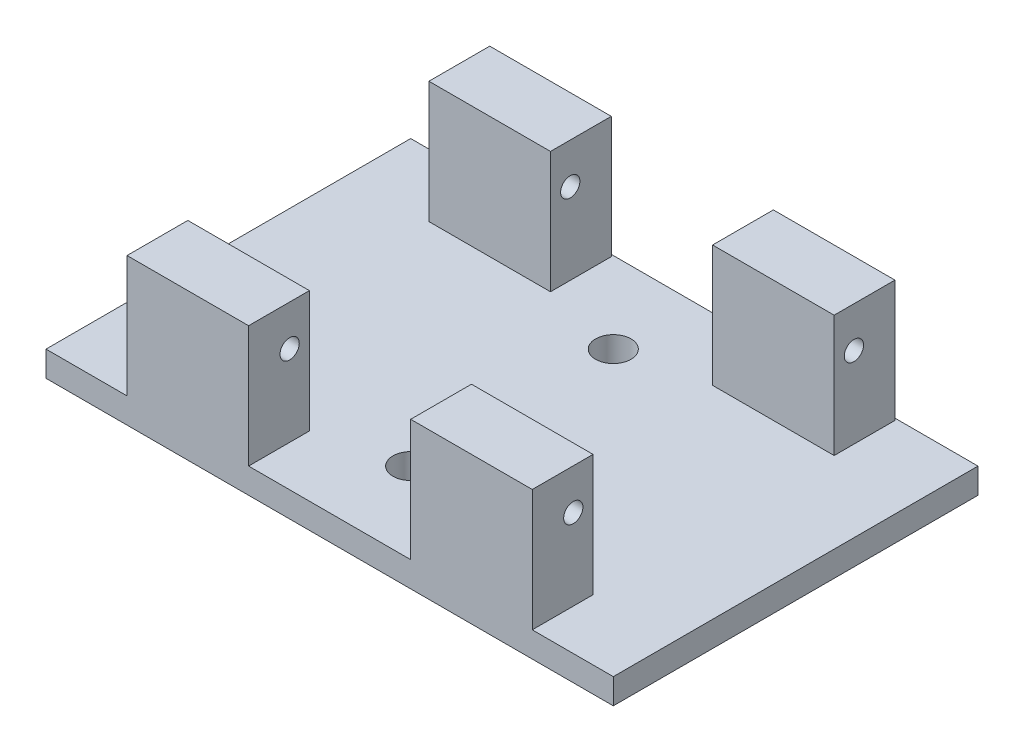
ISO-10303-21;
HEADER;
FILE_DESCRIPTION(('STEP AP214'),'2;1');
FILE_NAME('part.step','',(''),(''),'','','');
FILE_SCHEMA(('AUTOMOTIVE_DESIGN { 1 0 10303 214 1 1 1 1 }'));
ENDSEC;
DATA;
#1=APPLICATION_CONTEXT('core data for automotive mechanical design processes');
#2=APPLICATION_PROTOCOL_DEFINITION('international standard','automotive_design',2000,#1);
#3=PRODUCT_CONTEXT('',#1,'mechanical');
#4=PRODUCT('Part','Part','',(#3));
#5=PRODUCT_RELATED_PRODUCT_CATEGORY('part','',(#4));
#6=PRODUCT_DEFINITION_FORMATION('','',#4);
#7=PRODUCT_DEFINITION_CONTEXT('part definition',#1,'design');
#8=PRODUCT_DEFINITION('design','',#6,#7);
#9=PRODUCT_DEFINITION_SHAPE('','',#8);
#10=(LENGTH_UNIT() NAMED_UNIT(*) SI_UNIT(.MILLI.,.METRE.));
#11=(NAMED_UNIT(*) PLANE_ANGLE_UNIT() SI_UNIT($,.RADIAN.));
#12=(NAMED_UNIT(*) SI_UNIT($,.STERADIAN.) SOLID_ANGLE_UNIT());
#13=UNCERTAINTY_MEASURE_WITH_UNIT(LENGTH_MEASURE(1.E-05),#10,'distance_accuracy_value','');
#14=(GEOMETRIC_REPRESENTATION_CONTEXT(3) GLOBAL_UNCERTAINTY_ASSIGNED_CONTEXT((#13)) GLOBAL_UNIT_ASSIGNED_CONTEXT((#10,
#11,#12)) REPRESENTATION_CONTEXT('',''));
#15=CARTESIAN_POINT('',(0.,0.,0.));
#16=DIRECTION('',(0.,0.,1.));
#17=DIRECTION('',(1.,0.,0.));
#18=AXIS2_PLACEMENT_3D('',#15,#16,#17);
#19=CARTESIAN_POINT('',(0.,2.5,0.));
#20=DIRECTION('',(0.,1.,0.));
#21=DIRECTION('',(0.,0.,1.));
#22=AXIS2_PLACEMENT_3D('',#19,#20,#21);
#23=PLANE('',#22);
#24=CARTESIAN_POINT('',(0.,2.5,10.));
#25=DIRECTION('',(0.,1.,0.));
#26=DIRECTION('',(0.,0.,1.));
#27=AXIS2_PLACEMENT_3D('',#24,#25,#26);
#28=CIRCLE('',#27,1.75);
#29=CARTESIAN_POINT('',(0.,2.5,11.75));
#30=VERTEX_POINT('',#29);
#31=EDGE_CURVE('E691',#30,#30,#28,.T.);
#32=ORIENTED_EDGE('',*,*,#31,.F.);
#33=EDGE_LOOP('',(#32));
#34=FACE_BOUND('',#33,.T.);
#35=CARTESIAN_POINT('',(0.,2.5,-10.));
#36=DIRECTION('',(0.,1.,0.));
#37=DIRECTION('',(0.,0.,1.));
#38=AXIS2_PLACEMENT_3D('',#35,#36,#37);
#39=CIRCLE('',#38,1.75);
#40=CARTESIAN_POINT('',(0.,2.5,-8.25));
#41=VERTEX_POINT('',#40);
#42=EDGE_CURVE('E692',#41,#41,#39,.T.);
#43=ORIENTED_EDGE('',*,*,#42,.F.);
#44=EDGE_LOOP('',(#43));
#45=FACE_BOUND('',#44,.T.);
#46=DIRECTION('',(0.,0.,1.));
#47=VECTOR('',#46,1.);
#48=CARTESIAN_POINT('',(-8.,2.5,-17.8));
#49=LINE('',#48,#47);
#50=CARTESIAN_POINT('',(-8.,2.5,-17.8));
#51=VERTEX_POINT('',#50);
#52=CARTESIAN_POINT('',(-8.,2.5,-11.8));
#53=VERTEX_POINT('',#52);
#54=EDGE_CURVE('E183',#51,#53,#49,.T.);
#55=ORIENTED_EDGE('',*,*,#54,.T.);
#56=DIRECTION('',(-1.,0.,0.));
#57=VECTOR('',#56,1.);
#58=CARTESIAN_POINT('',(-8.,2.5,-11.8));
#59=LINE('',#58,#57);
#60=CARTESIAN_POINT('',(-20.,2.5,-11.8));
#61=VERTEX_POINT('',#60);
#62=EDGE_CURVE('E197',#53,#61,#59,.T.);
#63=ORIENTED_EDGE('',*,*,#62,.T.);
#64=DIRECTION('',(0.,0.,-1.));
#65=VECTOR('',#64,1.);
#66=CARTESIAN_POINT('',(-20.,2.5,-17.8));
#67=LINE('',#66,#65);
#68=CARTESIAN_POINT('',(-20.,2.5,-17.8));
#69=VERTEX_POINT('',#68);
#70=EDGE_CURVE('E61',#61,#69,#67,.T.);
#71=ORIENTED_EDGE('',*,*,#70,.T.);
#72=DIRECTION('',(1.,0.,0.));
#73=VECTOR('',#72,1.);
#74=CARTESIAN_POINT('',(-8.,2.5,-17.8));
#75=LINE('',#74,#73);
#76=EDGE_CURVE('E56',#69,#51,#75,.T.);
#77=ORIENTED_EDGE('',*,*,#76,.T.);
#78=EDGE_LOOP('',(#55,#63,#71,#77));
#79=FACE_BOUND('',#78,.T.);
#80=DIRECTION('',(0.,0.,1.));
#81=VECTOR('',#80,1.);
#82=CARTESIAN_POINT('',(-8.,2.5,12.));
#83=LINE('',#82,#81);
#84=CARTESIAN_POINT('',(-8.,2.5,12.));
#85=VERTEX_POINT('',#84);
#86=CARTESIAN_POINT('',(-8.,2.5,18.));
#87=VERTEX_POINT('',#86);
#88=EDGE_CURVE('E231',#85,#87,#83,.T.);
#89=ORIENTED_EDGE('',*,*,#88,.T.);
#90=DIRECTION('',(1.,0.,0.));
#91=VECTOR('',#90,1.);
#92=CARTESIAN_POINT('',(-28.,2.5,18.));
#93=LINE('',#92,#91);
#94=CARTESIAN_POINT('',(7.99999999999999,2.5,18.));
#95=VERTEX_POINT('',#94);
#96=EDGE_CURVE('E331',#87,#95,#93,.T.);
#97=ORIENTED_EDGE('',*,*,#96,.T.);
#98=DIRECTION('',(0.,0.,1.));
#99=VECTOR('',#98,1.);
#100=CARTESIAN_POINT('',(8.,2.5,12.));
#101=LINE('',#100,#99);
#102=CARTESIAN_POINT('',(8.,2.5,12.));
#103=VERTEX_POINT('',#102);
#104=EDGE_CURVE('E275',#103,#95,#101,.T.);
#105=ORIENTED_EDGE('',*,*,#104,.F.);
#106=DIRECTION('',(-1.,0.,0.));
#107=VECTOR('',#106,1.);
#108=CARTESIAN_POINT('',(8.,2.5,12.));
#109=LINE('',#108,#107);
#110=CARTESIAN_POINT('',(20.,2.5,12.));
#111=VERTEX_POINT('',#110);
#112=EDGE_CURVE('E303',#111,#103,#109,.T.);
#113=ORIENTED_EDGE('',*,*,#112,.F.);
#114=DIRECTION('',(0.,0.,-1.));
#115=VECTOR('',#114,1.);
#116=CARTESIAN_POINT('',(20.,2.5,12.));
#117=LINE('',#116,#115);
#118=CARTESIAN_POINT('',(20.,2.5,18.));
#119=VERTEX_POINT('',#118);
#120=EDGE_CURVE('E306',#119,#111,#117,.T.);
#121=ORIENTED_EDGE('',*,*,#120,.F.);
#122=CARTESIAN_POINT('',(28.,2.5,18.));
#123=VERTEX_POINT('',#122);
#124=EDGE_CURVE('E327',#119,#123,#93,.T.);
#125=ORIENTED_EDGE('',*,*,#124,.T.);
#126=DIRECTION('',(0.,0.,-1.));
#127=VECTOR('',#126,1.);
#128=CARTESIAN_POINT('',(28.,2.5,-18.));
#129=LINE('',#128,#127);
#130=CARTESIAN_POINT('',(28.,2.5,-18.));
#131=VERTEX_POINT('',#130);
#132=EDGE_CURVE('E319',#123,#131,#129,.T.);
#133=ORIENTED_EDGE('',*,*,#132,.T.);
#134=DIRECTION('',(-1.,0.,0.));
#135=VECTOR('',#134,1.);
#136=CARTESIAN_POINT('',(-28.,2.5,-18.));
#137=LINE('',#136,#135);
#138=CARTESIAN_POINT('',(-28.,2.5,-18.));
#139=VERTEX_POINT('',#138);
#140=EDGE_CURVE('E322',#131,#139,#137,.T.);
#141=ORIENTED_EDGE('',*,*,#140,.T.);
#142=DIRECTION('',(0.,0.,1.));
#143=VECTOR('',#142,1.);
#144=CARTESIAN_POINT('',(-28.,2.5,-18.));
#145=LINE('',#144,#143);
#146=CARTESIAN_POINT('',(-28.,2.5,18.));
#147=VERTEX_POINT('',#146);
#148=EDGE_CURVE('E325',#139,#147,#145,.T.);
#149=ORIENTED_EDGE('',*,*,#148,.T.);
#150=CARTESIAN_POINT('',(-20.,2.5,18.));
#151=VERTEX_POINT('',#150);
#152=EDGE_CURVE('E328',#147,#151,#93,.T.);
#153=ORIENTED_EDGE('',*,*,#152,.T.);
#154=DIRECTION('',(0.,0.,-1.));
#155=VECTOR('',#154,1.);
#156=CARTESIAN_POINT('',(-20.,2.5,12.));
#157=LINE('',#156,#155);
#158=CARTESIAN_POINT('',(-20.,2.5,12.));
#159=VERTEX_POINT('',#158);
#160=EDGE_CURVE('E221',#151,#159,#157,.T.);
#161=ORIENTED_EDGE('',*,*,#160,.T.);
#162=DIRECTION('',(1.,0.,0.));
#163=VECTOR('',#162,1.);
#164=CARTESIAN_POINT('',(-8.,2.5,12.));
#165=LINE('',#164,#163);
#166=EDGE_CURVE('E234',#159,#85,#165,.T.);
#167=ORIENTED_EDGE('',*,*,#166,.T.);
#168=EDGE_LOOP('',(#89,#97,#105,#113,#121,#125,#133,#141,#149,#153,#161,#167));
#169=FACE_BOUND('',#168,.T.);
#170=DIRECTION('',(1.,0.,0.));
#171=VECTOR('',#170,1.);
#172=CARTESIAN_POINT('',(8.,2.5,-11.8));
#173=LINE('',#172,#171);
#174=CARTESIAN_POINT('',(8.,2.5,-11.8));
#175=VERTEX_POINT('',#174);
#176=CARTESIAN_POINT('',(20.,2.5,-11.8));
#177=VERTEX_POINT('',#176);
#178=EDGE_CURVE('E274',#175,#177,#173,.T.);
#179=ORIENTED_EDGE('',*,*,#178,.F.);
#180=DIRECTION('',(0.,0.,1.));
#181=VECTOR('',#180,1.);
#182=CARTESIAN_POINT('',(8.,2.5,-17.8));
#183=LINE('',#182,#181);
#184=CARTESIAN_POINT('',(8.,2.5,-17.8));
#185=VERTEX_POINT('',#184);
#186=EDGE_CURVE('E271',#185,#175,#183,.T.);
#187=ORIENTED_EDGE('',*,*,#186,.F.);
#188=DIRECTION('',(-1.,0.,0.));
#189=VECTOR('',#188,1.);
#190=CARTESIAN_POINT('',(8.,2.5,-17.8));
#191=LINE('',#190,#189);
#192=CARTESIAN_POINT('',(20.,2.5,-17.8));
#193=VERTEX_POINT('',#192);
#194=EDGE_CURVE('E264',#193,#185,#191,.T.);
#195=ORIENTED_EDGE('',*,*,#194,.F.);
#196=DIRECTION('',(0.,0.,-1.));
#197=VECTOR('',#196,1.);
#198=CARTESIAN_POINT('',(20.,2.5,-17.8));
#199=LINE('',#198,#197);
#200=EDGE_CURVE('E277',#177,#193,#199,.T.);
#201=ORIENTED_EDGE('',*,*,#200,.F.);
#202=EDGE_LOOP('',(#179,#187,#195,#201));
#203=FACE_BOUND('',#202,.T.);
#204=ADVANCED_FACE('F41',(#34,#45,#79,#169,#203),#23,.T.);
#205=CARTESIAN_POINT('',(28.,2.5,-18.));
#206=DIRECTION('',(-1.,0.,0.));
#207=DIRECTION('',(0.,0.,1.));
#208=AXIS2_PLACEMENT_3D('',#205,#206,#207);
#209=PLANE('',#208);
#210=DIRECTION('',(0.,0.,-1.));
#211=VECTOR('',#210,1.);
#212=CARTESIAN_POINT('',(28.,0.,-18.));
#213=LINE('',#212,#211);
#214=CARTESIAN_POINT('',(28.,0.,18.));
#215=VERTEX_POINT('',#214);
#216=CARTESIAN_POINT('',(28.,0.,-18.));
#217=VERTEX_POINT('',#216);
#218=EDGE_CURVE('E290',#215,#217,#213,.T.);
#219=ORIENTED_EDGE('',*,*,#218,.T.);
#220=DIRECTION('',(0.,-1.,0.));
#221=VECTOR('',#220,1.);
#222=CARTESIAN_POINT('',(28.,2.5,-18.));
#223=LINE('',#222,#221);
#224=EDGE_CURVE('E11',#131,#217,#223,.T.);
#225=ORIENTED_EDGE('',*,*,#224,.F.);
#226=ORIENTED_EDGE('',*,*,#132,.F.);
#227=DIRECTION('',(0.,-1.,0.));
#228=VECTOR('',#227,1.);
#229=CARTESIAN_POINT('',(28.,2.5,18.));
#230=LINE('',#229,#228);
#231=EDGE_CURVE('E330',#123,#215,#230,.T.);
#232=ORIENTED_EDGE('',*,*,#231,.T.);
#233=EDGE_LOOP('',(#219,#225,#226,#232));
#234=FACE_BOUND('',#233,.T.);
#235=ADVANCED_FACE('F43',(#234),#209,.F.);
#236=CARTESIAN_POINT('',(-28.,2.5,-18.));
#237=DIRECTION('',(0.,0.,1.));
#238=DIRECTION('',(1.,0.,0.));
#239=AXIS2_PLACEMENT_3D('',#236,#237,#238);
#240=PLANE('',#239);
#241=DIRECTION('',(-1.,0.,0.));
#242=VECTOR('',#241,1.);
#243=CARTESIAN_POINT('',(-28.,0.,-18.));
#244=LINE('',#243,#242);
#245=CARTESIAN_POINT('',(-28.,0.,-18.));
#246=VERTEX_POINT('',#245);
#247=EDGE_CURVE('E334',#217,#246,#244,.T.);
#248=ORIENTED_EDGE('',*,*,#247,.T.);
#249=DIRECTION('',(0.,-1.,0.));
#250=VECTOR('',#249,1.);
#251=CARTESIAN_POINT('',(-28.,2.5,-18.));
#252=LINE('',#251,#250);
#253=EDGE_CURVE('E49',#139,#246,#252,.T.);
#254=ORIENTED_EDGE('',*,*,#253,.F.);
#255=ORIENTED_EDGE('',*,*,#140,.F.);
#256=ORIENTED_EDGE('',*,*,#224,.T.);
#257=EDGE_LOOP('',(#248,#254,#255,#256));
#258=FACE_BOUND('',#257,.T.);
#259=ADVANCED_FACE('F401',(#258),#240,.F.);
#260=CARTESIAN_POINT('',(-28.,2.5,-18.));
#261=DIRECTION('',(1.,0.,0.));
#262=DIRECTION('',(0.,0.,-1.));
#263=AXIS2_PLACEMENT_3D('',#260,#261,#262);
#264=PLANE('',#263);
#265=DIRECTION('',(0.,0.,1.));
#266=VECTOR('',#265,1.);
#267=CARTESIAN_POINT('',(-28.,0.,-18.));
#268=LINE('',#267,#266);
#269=CARTESIAN_POINT('',(-28.,0.,18.));
#270=VERTEX_POINT('',#269);
#271=EDGE_CURVE('E336',#246,#270,#268,.T.);
#272=ORIENTED_EDGE('',*,*,#271,.T.);
#273=DIRECTION('',(0.,-1.,0.));
#274=VECTOR('',#273,1.);
#275=CARTESIAN_POINT('',(-28.,2.5,18.));
#276=LINE('',#275,#274);
#277=EDGE_CURVE('E341',#147,#270,#276,.T.);
#278=ORIENTED_EDGE('',*,*,#277,.F.);
#279=ORIENTED_EDGE('',*,*,#148,.F.);
#280=ORIENTED_EDGE('',*,*,#253,.T.);
#281=EDGE_LOOP('',(#272,#278,#279,#280));
#282=FACE_BOUND('',#281,.T.);
#283=ADVANCED_FACE('F348',(#282),#264,.F.);
#284=CARTESIAN_POINT('',(-28.,2.5,18.));
#285=DIRECTION('',(0.,0.,-1.));
#286=DIRECTION('',(-1.,0.,0.));
#287=AXIS2_PLACEMENT_3D('',#284,#285,#286);
#288=PLANE('',#287);
#289=DIRECTION('',(1.,0.,0.));
#290=VECTOR('',#289,1.);
#291=CARTESIAN_POINT('',(-28.,0.,18.));
#292=LINE('',#291,#290);
#293=EDGE_CURVE('E323',#270,#215,#292,.T.);
#294=ORIENTED_EDGE('',*,*,#293,.T.);
#295=ORIENTED_EDGE('',*,*,#231,.F.);
#296=ORIENTED_EDGE('',*,*,#124,.F.);
#297=DIRECTION('',(0.,-1.,0.));
#298=VECTOR('',#297,1.);
#299=CARTESIAN_POINT('',(20.,14.5,18.));
#300=LINE('',#299,#298);
#301=CARTESIAN_POINT('',(20.,14.5,18.));
#302=VERTEX_POINT('',#301);
#303=EDGE_CURVE('E293',#302,#119,#300,.T.);
#304=ORIENTED_EDGE('',*,*,#303,.F.);
#305=DIRECTION('',(1.,0.,0.));
#306=VECTOR('',#305,1.);
#307=CARTESIAN_POINT('',(8.,14.5,18.));
#308=LINE('',#307,#306);
#309=CARTESIAN_POINT('',(8.,14.5,18.));
#310=VERTEX_POINT('',#309);
#311=EDGE_CURVE('E315',#310,#302,#308,.T.);
#312=ORIENTED_EDGE('',*,*,#311,.F.);
#313=DIRECTION('',(0.,-1.,0.));
#314=VECTOR('',#313,1.);
#315=CARTESIAN_POINT('',(8.,14.5,18.));
#316=LINE('',#315,#314);
#317=EDGE_CURVE('E259',#310,#95,#316,.T.);
#318=ORIENTED_EDGE('',*,*,#317,.T.);
#319=ORIENTED_EDGE('',*,*,#96,.F.);
#320=DIRECTION('',(0.,-1.,0.));
#321=VECTOR('',#320,1.);
#322=CARTESIAN_POINT('',(-8.,14.5,18.));
#323=LINE('',#322,#321);
#324=CARTESIAN_POINT('',(-8.,14.5,18.));
#325=VERTEX_POINT('',#324);
#326=EDGE_CURVE('E230',#325,#87,#323,.T.);
#327=ORIENTED_EDGE('',*,*,#326,.F.);
#328=DIRECTION('',(-1.,0.,0.));
#329=VECTOR('',#328,1.);
#330=CARTESIAN_POINT('',(-8.,14.5,18.));
#331=LINE('',#330,#329);
#332=CARTESIAN_POINT('',(-20.,14.5,18.));
#333=VERTEX_POINT('',#332);
#334=EDGE_CURVE('E227',#325,#333,#331,.T.);
#335=ORIENTED_EDGE('',*,*,#334,.T.);
#336=DIRECTION('',(0.,-1.,0.));
#337=VECTOR('',#336,1.);
#338=CARTESIAN_POINT('',(-20.,14.5,18.));
#339=LINE('',#338,#337);
#340=EDGE_CURVE('E240',#333,#151,#339,.T.);
#341=ORIENTED_EDGE('',*,*,#340,.T.);
#342=ORIENTED_EDGE('',*,*,#152,.F.);
#343=ORIENTED_EDGE('',*,*,#277,.T.);
#344=EDGE_LOOP('',(#294,#295,#296,#304,#312,#318,#319,#327,#335,#341,#342,#343));
#345=FACE_BOUND('',#344,.T.);
#346=ADVANCED_FACE('F357',(#345),#288,.F.);
#347=CARTESIAN_POINT('',(0.,0.,0.));
#348=DIRECTION('',(0.,1.,0.));
#349=DIRECTION('',(0.,0.,1.));
#350=AXIS2_PLACEMENT_3D('',#347,#348,#349);
#351=PLANE('',#350);
#352=CARTESIAN_POINT('',(0.,0.,10.));
#353=DIRECTION('',(0.,1.,0.));
#354=DIRECTION('',(0.,0.,1.));
#355=AXIS2_PLACEMENT_3D('',#352,#353,#354);
#356=CIRCLE('',#355,1.75);
#357=CARTESIAN_POINT('',(0.,0.,11.75));
#358=VERTEX_POINT('',#357);
#359=EDGE_CURVE('E689',#358,#358,#356,.T.);
#360=ORIENTED_EDGE('',*,*,#359,.T.);
#361=EDGE_LOOP('',(#360));
#362=FACE_BOUND('',#361,.T.);
#363=CARTESIAN_POINT('',(0.,0.,-10.));
#364=DIRECTION('',(0.,1.,0.));
#365=DIRECTION('',(0.,0.,1.));
#366=AXIS2_PLACEMENT_3D('',#363,#364,#365);
#367=CIRCLE('',#366,1.75);
#368=CARTESIAN_POINT('',(0.,0.,-8.25));
#369=VERTEX_POINT('',#368);
#370=EDGE_CURVE('E697',#369,#369,#367,.T.);
#371=ORIENTED_EDGE('',*,*,#370,.T.);
#372=EDGE_LOOP('',(#371));
#373=FACE_BOUND('',#372,.T.);
#374=ORIENTED_EDGE('',*,*,#218,.F.);
#375=ORIENTED_EDGE('',*,*,#293,.F.);
#376=ORIENTED_EDGE('',*,*,#271,.F.);
#377=ORIENTED_EDGE('',*,*,#247,.F.);
#378=EDGE_LOOP('',(#374,#375,#376,#377));
#379=FACE_BOUND('',#378,.T.);
#380=ADVANCED_FACE('F354',(#362,#373,#379),#351,.F.);
#381=CARTESIAN_POINT('',(8.,14.5,-17.8));
#382=DIRECTION('',(1.,0.,0.));
#383=DIRECTION('',(0.,0.,-1.));
#384=AXIS2_PLACEMENT_3D('',#381,#382,#383);
#385=PLANE('',#384);
#386=CARTESIAN_POINT('',(8.,10.5,-13.75));
#387=DIRECTION('',(1.,0.,0.));
#388=DIRECTION('',(0.,0.,-1.));
#389=AXIS2_PLACEMENT_3D('',#386,#387,#388);
#390=CIRCLE('',#389,0.949999999999999);
#391=CARTESIAN_POINT('',(8.,10.5,-14.7));
#392=VERTEX_POINT('',#391);
#393=EDGE_CURVE('E256',#392,#392,#390,.T.);
#394=ORIENTED_EDGE('',*,*,#393,.T.);
#395=EDGE_LOOP('',(#394));
#396=FACE_BOUND('',#395,.T.);
#397=ORIENTED_EDGE('',*,*,#186,.T.);
#398=DIRECTION('',(0.,-1.,0.));
#399=VECTOR('',#398,1.);
#400=CARTESIAN_POINT('',(8.,14.5,-11.8));
#401=LINE('',#400,#399);
#402=CARTESIAN_POINT('',(8.,14.5,-11.8));
#403=VERTEX_POINT('',#402);
#404=EDGE_CURVE('E288',#403,#175,#401,.T.);
#405=ORIENTED_EDGE('',*,*,#404,.F.);
#406=DIRECTION('',(0.,0.,1.));
#407=VECTOR('',#406,1.);
#408=CARTESIAN_POINT('',(8.,14.5,-17.8));
#409=LINE('',#408,#407);
#410=CARTESIAN_POINT('',(8.,14.5,-17.8));
#411=VERTEX_POINT('',#410);
#412=EDGE_CURVE('E260',#411,#403,#409,.T.);
#413=ORIENTED_EDGE('',*,*,#412,.F.);
#414=DIRECTION('',(0.,-1.,0.));
#415=VECTOR('',#414,1.);
#416=CARTESIAN_POINT('',(8.,14.5,-17.8));
#417=LINE('',#416,#415);
#418=EDGE_CURVE('E270',#411,#185,#417,.T.);
#419=ORIENTED_EDGE('',*,*,#418,.T.);
#420=EDGE_LOOP('',(#397,#405,#413,#419));
#421=FACE_BOUND('',#420,.T.);
#422=ADVANCED_FACE('F406',(#396,#421),#385,.F.);
#423=CARTESIAN_POINT('',(8.,14.5,-11.8));
#424=DIRECTION('',(0.,0.,-1.));
#425=DIRECTION('',(-1.,0.,0.));
#426=AXIS2_PLACEMENT_3D('',#423,#424,#425);
#427=PLANE('',#426);
#428=ORIENTED_EDGE('',*,*,#178,.T.);
#429=DIRECTION('',(0.,-1.,0.));
#430=VECTOR('',#429,1.);
#431=CARTESIAN_POINT('',(20.,14.5,-11.8));
#432=LINE('',#431,#430);
#433=CARTESIAN_POINT('',(20.,14.5,-11.8));
#434=VERTEX_POINT('',#433);
#435=EDGE_CURVE('E285',#434,#177,#432,.T.);
#436=ORIENTED_EDGE('',*,*,#435,.F.);
#437=DIRECTION('',(1.,0.,0.));
#438=VECTOR('',#437,1.);
#439=CARTESIAN_POINT('',(8.,14.5,-11.8));
#440=LINE('',#439,#438);
#441=EDGE_CURVE('E263',#403,#434,#440,.T.);
#442=ORIENTED_EDGE('',*,*,#441,.F.);
#443=ORIENTED_EDGE('',*,*,#404,.T.);
#444=EDGE_LOOP('',(#428,#436,#442,#443));
#445=FACE_BOUND('',#444,.T.);
#446=ADVANCED_FACE('F426',(#445),#427,.F.);
#447=CARTESIAN_POINT('',(20.,14.5,-17.8));
#448=DIRECTION('',(-1.,0.,0.));
#449=DIRECTION('',(0.,0.,1.));
#450=AXIS2_PLACEMENT_3D('',#447,#448,#449);
#451=PLANE('',#450);
#452=CARTESIAN_POINT('',(20.,10.5,-13.75));
#453=DIRECTION('',(1.,0.,0.));
#454=DIRECTION('',(0.,0.,-1.));
#455=AXIS2_PLACEMENT_3D('',#452,#453,#454);
#456=CIRCLE('',#455,0.949999999999999);
#457=CARTESIAN_POINT('',(20.,10.5,-14.7));
#458=VERTEX_POINT('',#457);
#459=EDGE_CURVE('E186',#458,#458,#456,.T.);
#460=ORIENTED_EDGE('',*,*,#459,.F.);
#461=EDGE_LOOP('',(#460));
#462=FACE_BOUND('',#461,.T.);
#463=ORIENTED_EDGE('',*,*,#200,.T.);
#464=DIRECTION('',(0.,-1.,0.));
#465=VECTOR('',#464,1.);
#466=CARTESIAN_POINT('',(20.,14.5,-17.8));
#467=LINE('',#466,#465);
#468=CARTESIAN_POINT('',(20.,14.5,-17.8));
#469=VERTEX_POINT('',#468);
#470=EDGE_CURVE('E283',#469,#193,#467,.T.);
#471=ORIENTED_EDGE('',*,*,#470,.F.);
#472=DIRECTION('',(0.,0.,-1.));
#473=VECTOR('',#472,1.);
#474=CARTESIAN_POINT('',(20.,14.5,-17.8));
#475=LINE('',#474,#473);
#476=EDGE_CURVE('E266',#434,#469,#475,.T.);
#477=ORIENTED_EDGE('',*,*,#476,.F.);
#478=ORIENTED_EDGE('',*,*,#435,.T.);
#479=EDGE_LOOP('',(#463,#471,#477,#478));
#480=FACE_BOUND('',#479,.T.);
#481=ADVANCED_FACE('F430',(#462,#480),#451,.F.);
#482=CARTESIAN_POINT('',(8.,14.5,-17.8));
#483=DIRECTION('',(0.,0.,1.));
#484=DIRECTION('',(1.,0.,0.));
#485=AXIS2_PLACEMENT_3D('',#482,#483,#484);
#486=PLANE('',#485);
#487=ORIENTED_EDGE('',*,*,#194,.T.);
#488=ORIENTED_EDGE('',*,*,#418,.F.);
#489=DIRECTION('',(-1.,0.,0.));
#490=VECTOR('',#489,1.);
#491=CARTESIAN_POINT('',(8.,14.5,-17.8));
#492=LINE('',#491,#490);
#493=EDGE_CURVE('E268',#469,#411,#492,.T.);
#494=ORIENTED_EDGE('',*,*,#493,.F.);
#495=ORIENTED_EDGE('',*,*,#470,.T.);
#496=EDGE_LOOP('',(#487,#488,#494,#495));
#497=FACE_BOUND('',#496,.T.);
#498=ADVANCED_FACE('F438',(#497),#486,.F.);
#499=CARTESIAN_POINT('',(0.,14.5,0.));
#500=DIRECTION('',(0.,1.,0.));
#501=DIRECTION('',(0.,0.,1.));
#502=AXIS2_PLACEMENT_3D('',#499,#500,#501);
#503=PLANE('',#502);
#504=ORIENTED_EDGE('',*,*,#412,.T.);
#505=ORIENTED_EDGE('',*,*,#441,.T.);
#506=ORIENTED_EDGE('',*,*,#476,.T.);
#507=ORIENTED_EDGE('',*,*,#493,.T.);
#508=EDGE_LOOP('',(#504,#505,#506,#507));
#509=FACE_BOUND('',#508,.T.);
#510=ADVANCED_FACE('F442',(#509),#503,.T.);
#511=CARTESIAN_POINT('',(8.,14.5,12.));
#512=DIRECTION('',(1.,0.,0.));
#513=DIRECTION('',(0.,0.,-1.));
#514=AXIS2_PLACEMENT_3D('',#511,#512,#513);
#515=PLANE('',#514);
#516=CARTESIAN_POINT('',(8.,10.5,13.95));
#517=DIRECTION('',(1.,0.,0.));
#518=DIRECTION('',(0.,0.,-1.));
#519=AXIS2_PLACEMENT_3D('',#516,#517,#518);
#520=CIRCLE('',#519,0.949999999999999);
#521=CARTESIAN_POINT('',(8.,10.5,13.));
#522=VERTEX_POINT('',#521);
#523=EDGE_CURVE('E251',#522,#522,#520,.T.);
#524=ORIENTED_EDGE('',*,*,#523,.T.);
#525=EDGE_LOOP('',(#524));
#526=FACE_BOUND('',#525,.T.);
#527=ORIENTED_EDGE('',*,*,#104,.T.);
#528=ORIENTED_EDGE('',*,*,#317,.F.);
#529=DIRECTION('',(0.,0.,1.));
#530=VECTOR('',#529,1.);
#531=CARTESIAN_POINT('',(8.,14.5,12.));
#532=LINE('',#531,#530);
#533=CARTESIAN_POINT('',(8.,14.5,12.));
#534=VERTEX_POINT('',#533);
#535=EDGE_CURVE('E307',#534,#310,#532,.T.);
#536=ORIENTED_EDGE('',*,*,#535,.F.);
#537=DIRECTION('',(0.,-1.,0.));
#538=VECTOR('',#537,1.);
#539=CARTESIAN_POINT('',(8.,14.5,12.));
#540=LINE('',#539,#538);
#541=EDGE_CURVE('E299',#534,#103,#540,.T.);
#542=ORIENTED_EDGE('',*,*,#541,.T.);
#543=EDGE_LOOP('',(#527,#528,#536,#542));
#544=FACE_BOUND('',#543,.T.);
#545=ADVANCED_FACE('F370',(#526,#544),#515,.F.);
#546=CARTESIAN_POINT('',(20.,14.5,12.));
#547=DIRECTION('',(-1.,0.,0.));
#548=DIRECTION('',(0.,0.,1.));
#549=AXIS2_PLACEMENT_3D('',#546,#547,#548);
#550=PLANE('',#549);
#551=CARTESIAN_POINT('',(20.,10.5,13.95));
#552=DIRECTION('',(1.,0.,0.));
#553=DIRECTION('',(0.,0.,-1.));
#554=AXIS2_PLACEMENT_3D('',#551,#552,#553);
#555=CIRCLE('',#554,0.949999999999999);
#556=CARTESIAN_POINT('',(20.,10.5,13.));
#557=VERTEX_POINT('',#556);
#558=EDGE_CURVE('E248',#557,#557,#555,.T.);
#559=ORIENTED_EDGE('',*,*,#558,.F.);
#560=EDGE_LOOP('',(#559));
#561=FACE_BOUND('',#560,.T.);
#562=ORIENTED_EDGE('',*,*,#120,.T.);
#563=DIRECTION('',(0.,-1.,0.));
#564=VECTOR('',#563,1.);
#565=CARTESIAN_POINT('',(20.,14.5,12.));
#566=LINE('',#565,#564);
#567=CARTESIAN_POINT('',(20.,14.5,12.));
#568=VERTEX_POINT('',#567);
#569=EDGE_CURVE('E296',#568,#111,#566,.T.);
#570=ORIENTED_EDGE('',*,*,#569,.F.);
#571=DIRECTION('',(0.,0.,-1.));
#572=VECTOR('',#571,1.);
#573=CARTESIAN_POINT('',(20.,14.5,12.));
#574=LINE('',#573,#572);
#575=EDGE_CURVE('E313',#302,#568,#574,.T.);
#576=ORIENTED_EDGE('',*,*,#575,.F.);
#577=ORIENTED_EDGE('',*,*,#303,.T.);
#578=EDGE_LOOP('',(#562,#570,#576,#577));
#579=FACE_BOUND('',#578,.T.);
#580=ADVANCED_FACE('F377',(#561,#579),#550,.F.);
#581=CARTESIAN_POINT('',(8.,14.5,12.));
#582=DIRECTION('',(0.,0.,1.));
#583=DIRECTION('',(1.,0.,0.));
#584=AXIS2_PLACEMENT_3D('',#581,#582,#583);
#585=PLANE('',#584);
#586=ORIENTED_EDGE('',*,*,#112,.T.);
#587=ORIENTED_EDGE('',*,*,#541,.F.);
#588=DIRECTION('',(-1.,0.,0.));
#589=VECTOR('',#588,1.);
#590=CARTESIAN_POINT('',(8.,14.5,12.));
#591=LINE('',#590,#589);
#592=EDGE_CURVE('E302',#568,#534,#591,.T.);
#593=ORIENTED_EDGE('',*,*,#592,.F.);
#594=ORIENTED_EDGE('',*,*,#569,.T.);
#595=EDGE_LOOP('',(#586,#587,#593,#594));
#596=FACE_BOUND('',#595,.T.);
#597=ADVANCED_FACE('F374',(#596),#585,.F.);
#598=CARTESIAN_POINT('',(0.,14.5,0.));
#599=DIRECTION('',(0.,1.,0.));
#600=DIRECTION('',(0.,0.,1.));
#601=AXIS2_PLACEMENT_3D('',#598,#599,#600);
#602=PLANE('',#601);
#603=ORIENTED_EDGE('',*,*,#535,.T.);
#604=ORIENTED_EDGE('',*,*,#311,.T.);
#605=ORIENTED_EDGE('',*,*,#575,.T.);
#606=ORIENTED_EDGE('',*,*,#592,.T.);
#607=EDGE_LOOP('',(#603,#604,#605,#606));
#608=FACE_BOUND('',#607,.T.);
#609=ADVANCED_FACE('F380',(#608),#602,.T.);
#610=CARTESIAN_POINT('',(-28.,10.5,13.95));
#611=DIRECTION('',(1.,0.,0.));
#612=DIRECTION('',(0.,0.,-1.));
#613=AXIS2_PLACEMENT_3D('',#610,#611,#612);
#614=CYLINDRICAL_SURFACE('',#613,0.949999999999999);
#615=ORIENTED_EDGE('',*,*,#558,.T.);
#616=EDGE_LOOP('',(#615));
#617=FACE_BOUND('',#616,.T.);
#618=ORIENTED_EDGE('',*,*,#523,.F.);
#619=EDGE_LOOP('',(#618));
#620=FACE_BOUND('',#619,.T.);
#621=ADVANCED_FACE('F382',(#617,#620),#614,.F.);
#622=CARTESIAN_POINT('',(-28.,10.5,-13.75));
#623=DIRECTION('',(1.,0.,0.));
#624=DIRECTION('',(0.,0.,-1.));
#625=AXIS2_PLACEMENT_3D('',#622,#623,#624);
#626=CYLINDRICAL_SURFACE('',#625,0.949999999999999);
#627=ORIENTED_EDGE('',*,*,#459,.T.);
#628=EDGE_LOOP('',(#627));
#629=FACE_BOUND('',#628,.T.);
#630=ORIENTED_EDGE('',*,*,#393,.F.);
#631=EDGE_LOOP('',(#630));
#632=FACE_BOUND('',#631,.T.);
#633=ADVANCED_FACE('F389',(#629,#632),#626,.F.);
#634=CARTESIAN_POINT('',(-8.,14.5,12.));
#635=DIRECTION('',(1.,0.,0.));
#636=DIRECTION('',(0.,0.,-1.));
#637=AXIS2_PLACEMENT_3D('',#634,#635,#636);
#638=PLANE('',#637);
#639=CARTESIAN_POINT('',(-7.99999999999999,10.5,13.95));
#640=DIRECTION('',(1.,0.,0.));
#641=DIRECTION('',(0.,0.,-1.));
#642=AXIS2_PLACEMENT_3D('',#639,#640,#641);
#643=CIRCLE('',#642,0.949999999999999);
#644=CARTESIAN_POINT('',(-7.99999999999999,10.5,13.));
#645=VERTEX_POINT('',#644);
#646=EDGE_CURVE('E235',#645,#645,#643,.F.);
#647=ORIENTED_EDGE('',*,*,#646,.T.);
#648=EDGE_LOOP('',(#647));
#649=FACE_BOUND('',#648,.T.);
#650=ORIENTED_EDGE('',*,*,#88,.F.);
#651=DIRECTION('',(0.,-1.,0.));
#652=VECTOR('',#651,1.);
#653=CARTESIAN_POINT('',(-8.,14.5,12.));
#654=LINE('',#653,#652);
#655=CARTESIAN_POINT('',(-8.,14.5,12.));
#656=VERTEX_POINT('',#655);
#657=EDGE_CURVE('E208',#656,#85,#654,.T.);
#658=ORIENTED_EDGE('',*,*,#657,.F.);
#659=DIRECTION('',(0.,0.,1.));
#660=VECTOR('',#659,1.);
#661=CARTESIAN_POINT('',(-8.,14.5,12.));
#662=LINE('',#661,#660);
#663=EDGE_CURVE('E217',#656,#325,#662,.T.);
#664=ORIENTED_EDGE('',*,*,#663,.T.);
#665=ORIENTED_EDGE('',*,*,#326,.T.);
#666=EDGE_LOOP('',(#650,#658,#664,#665));
#667=FACE_BOUND('',#666,.T.);
#668=ADVANCED_FACE('F483',(#649,#667),#638,.T.);
#669=CARTESIAN_POINT('',(-8.,14.5,12.));
#670=DIRECTION('',(0.,0.,-1.));
#671=DIRECTION('',(-1.,0.,0.));
#672=AXIS2_PLACEMENT_3D('',#669,#670,#671);
#673=PLANE('',#672);
#674=ORIENTED_EDGE('',*,*,#166,.F.);
#675=DIRECTION('',(0.,-1.,0.));
#676=VECTOR('',#675,1.);
#677=CARTESIAN_POINT('',(-20.,14.5,12.));
#678=LINE('',#677,#676);
#679=CARTESIAN_POINT('',(-20.,14.5,12.));
#680=VERTEX_POINT('',#679);
#681=EDGE_CURVE('E243',#680,#159,#678,.T.);
#682=ORIENTED_EDGE('',*,*,#681,.F.);
#683=DIRECTION('',(1.,0.,0.));
#684=VECTOR('',#683,1.);
#685=CARTESIAN_POINT('',(-8.,14.5,12.));
#686=LINE('',#685,#684);
#687=EDGE_CURVE('E220',#680,#656,#686,.T.);
#688=ORIENTED_EDGE('',*,*,#687,.T.);
#689=ORIENTED_EDGE('',*,*,#657,.T.);
#690=EDGE_LOOP('',(#674,#682,#688,#689));
#691=FACE_BOUND('',#690,.T.);
#692=ADVANCED_FACE('F501',(#691),#673,.T.);
#693=CARTESIAN_POINT('',(-20.,14.5,12.));
#694=DIRECTION('',(-1.,0.,0.));
#695=DIRECTION('',(0.,0.,1.));
#696=AXIS2_PLACEMENT_3D('',#693,#694,#695);
#697=PLANE('',#696);
#698=CARTESIAN_POINT('',(-20.,10.5,13.95));
#699=DIRECTION('',(1.,0.,0.));
#700=DIRECTION('',(0.,0.,-1.));
#701=AXIS2_PLACEMENT_3D('',#698,#699,#700);
#702=CIRCLE('',#701,0.949999999999999);
#703=CARTESIAN_POINT('',(-20.,10.5,13.));
#704=VERTEX_POINT('',#703);
#705=EDGE_CURVE('E702',#704,#704,#702,.T.);
#706=ORIENTED_EDGE('',*,*,#705,.T.);
#707=EDGE_LOOP('',(#706));
#708=FACE_BOUND('',#707,.T.);
#709=ORIENTED_EDGE('',*,*,#160,.F.);
#710=ORIENTED_EDGE('',*,*,#340,.F.);
#711=DIRECTION('',(0.,0.,-1.));
#712=VECTOR('',#711,1.);
#713=CARTESIAN_POINT('',(-20.,14.5,12.));
#714=LINE('',#713,#712);
#715=EDGE_CURVE('E224',#333,#680,#714,.T.);
#716=ORIENTED_EDGE('',*,*,#715,.T.);
#717=ORIENTED_EDGE('',*,*,#681,.T.);
#718=EDGE_LOOP('',(#709,#710,#716,#717));
#719=FACE_BOUND('',#718,.T.);
#720=ADVANCED_FACE('F511',(#708,#719),#697,.T.);
#721=CARTESIAN_POINT('',(0.,14.5,0.));
#722=DIRECTION('',(0.,1.,0.));
#723=DIRECTION('',(0.,0.,1.));
#724=AXIS2_PLACEMENT_3D('',#721,#722,#723);
#725=PLANE('',#724);
#726=ORIENTED_EDGE('',*,*,#663,.F.);
#727=ORIENTED_EDGE('',*,*,#687,.F.);
#728=ORIENTED_EDGE('',*,*,#715,.F.);
#729=ORIENTED_EDGE('',*,*,#334,.F.);
#730=EDGE_LOOP('',(#726,#727,#728,#729));
#731=FACE_BOUND('',#730,.T.);
#732=ADVANCED_FACE('F521',(#731),#725,.T.);
#733=CARTESIAN_POINT('',(-8.,14.5,-17.8));
#734=DIRECTION('',(1.,0.,0.));
#735=DIRECTION('',(0.,0.,-1.));
#736=AXIS2_PLACEMENT_3D('',#733,#734,#735);
#737=PLANE('',#736);
#738=CARTESIAN_POINT('',(-7.99999999999999,10.5,-13.75));
#739=DIRECTION('',(1.,0.,0.));
#740=DIRECTION('',(0.,0.,-1.));
#741=AXIS2_PLACEMENT_3D('',#738,#739,#740);
#742=CIRCLE('',#741,0.949999999999999);
#743=CARTESIAN_POINT('',(-7.99999999999999,10.5,-14.7));
#744=VERTEX_POINT('',#743);
#745=EDGE_CURVE('E705',#744,#744,#742,.F.);
#746=ORIENTED_EDGE('',*,*,#745,.T.);
#747=EDGE_LOOP('',(#746));
#748=FACE_BOUND('',#747,.T.);
#749=ORIENTED_EDGE('',*,*,#54,.F.);
#750=DIRECTION('',(0.,-1.,0.));
#751=VECTOR('',#750,1.);
#752=CARTESIAN_POINT('',(-8.,14.5,-17.8));
#753=LINE('',#752,#751);
#754=CARTESIAN_POINT('',(-8.,14.5,-17.8));
#755=VERTEX_POINT('',#754);
#756=EDGE_CURVE('E177',#755,#51,#753,.T.);
#757=ORIENTED_EDGE('',*,*,#756,.F.);
#758=DIRECTION('',(0.,0.,1.));
#759=VECTOR('',#758,1.);
#760=CARTESIAN_POINT('',(-8.,14.5,-17.8));
#761=LINE('',#760,#759);
#762=CARTESIAN_POINT('',(-8.,14.5,-11.8));
#763=VERTEX_POINT('',#762);
#764=EDGE_CURVE('E181',#755,#763,#761,.T.);
#765=ORIENTED_EDGE('',*,*,#764,.T.);
#766=DIRECTION('',(0.,-1.,0.));
#767=VECTOR('',#766,1.);
#768=CARTESIAN_POINT('',(-8.,14.5,-11.8));
#769=LINE('',#768,#767);
#770=EDGE_CURVE('E206',#763,#53,#769,.T.);
#771=ORIENTED_EDGE('',*,*,#770,.T.);
#772=EDGE_LOOP('',(#749,#757,#765,#771));
#773=FACE_BOUND('',#772,.T.);
#774=ADVANCED_FACE('F179',(#748,#773),#737,.T.);
#775=CARTESIAN_POINT('',(-8.,14.5,-17.8));
#776=DIRECTION('',(0.,0.,-1.));
#777=DIRECTION('',(-1.,0.,0.));
#778=AXIS2_PLACEMENT_3D('',#775,#776,#777);
#779=PLANE('',#778);
#780=ORIENTED_EDGE('',*,*,#76,.F.);
#781=DIRECTION('',(0.,-1.,0.));
#782=VECTOR('',#781,1.);
#783=CARTESIAN_POINT('',(-20.,14.5,-17.8));
#784=LINE('',#783,#782);
#785=CARTESIAN_POINT('',(-20.,14.5,-17.8));
#786=VERTEX_POINT('',#785);
#787=EDGE_CURVE('E187',#786,#69,#784,.T.);
#788=ORIENTED_EDGE('',*,*,#787,.F.);
#789=DIRECTION('',(1.,0.,0.));
#790=VECTOR('',#789,1.);
#791=CARTESIAN_POINT('',(-8.,14.5,-17.8));
#792=LINE('',#791,#790);
#793=EDGE_CURVE('E193',#786,#755,#792,.T.);
#794=ORIENTED_EDGE('',*,*,#793,.T.);
#795=ORIENTED_EDGE('',*,*,#756,.T.);
#796=EDGE_LOOP('',(#780,#788,#794,#795));
#797=FACE_BOUND('',#796,.T.);
#798=ADVANCED_FACE('F199',(#797),#779,.T.);
#799=CARTESIAN_POINT('',(-20.,14.5,-17.8));
#800=DIRECTION('',(-1.,0.,0.));
#801=DIRECTION('',(0.,0.,1.));
#802=AXIS2_PLACEMENT_3D('',#799,#800,#801);
#803=PLANE('',#802);
#804=CARTESIAN_POINT('',(-20.,10.5,-13.75));
#805=DIRECTION('',(1.,0.,0.));
#806=DIRECTION('',(0.,0.,-1.));
#807=AXIS2_PLACEMENT_3D('',#804,#805,#806);
#808=CIRCLE('',#807,0.949999999999999);
#809=CARTESIAN_POINT('',(-20.,10.5,-14.7));
#810=VERTEX_POINT('',#809);
#811=EDGE_CURVE('E694',#810,#810,#808,.T.);
#812=ORIENTED_EDGE('',*,*,#811,.T.);
#813=EDGE_LOOP('',(#812));
#814=FACE_BOUND('',#813,.T.);
#815=ORIENTED_EDGE('',*,*,#70,.F.);
#816=DIRECTION('',(0.,-1.,0.));
#817=VECTOR('',#816,1.);
#818=CARTESIAN_POINT('',(-20.,14.5,-11.8));
#819=LINE('',#818,#817);
#820=CARTESIAN_POINT('',(-20.,14.5,-11.8));
#821=VERTEX_POINT('',#820);
#822=EDGE_CURVE('E213',#821,#61,#819,.T.);
#823=ORIENTED_EDGE('',*,*,#822,.F.);
#824=DIRECTION('',(0.,0.,-1.));
#825=VECTOR('',#824,1.);
#826=CARTESIAN_POINT('',(-20.,14.5,-17.8));
#827=LINE('',#826,#825);
#828=EDGE_CURVE('E200',#821,#786,#827,.T.);
#829=ORIENTED_EDGE('',*,*,#828,.T.);
#830=ORIENTED_EDGE('',*,*,#787,.T.);
#831=EDGE_LOOP('',(#815,#823,#829,#830));
#832=FACE_BOUND('',#831,.T.);
#833=ADVANCED_FACE('F549',(#814,#832),#803,.T.);
#834=CARTESIAN_POINT('',(-8.,14.5,-11.8));
#835=DIRECTION('',(0.,0.,1.));
#836=DIRECTION('',(1.,0.,0.));
#837=AXIS2_PLACEMENT_3D('',#834,#835,#836);
#838=PLANE('',#837);
#839=ORIENTED_EDGE('',*,*,#62,.F.);
#840=ORIENTED_EDGE('',*,*,#770,.F.);
#841=DIRECTION('',(-1.,0.,0.));
#842=VECTOR('',#841,1.);
#843=CARTESIAN_POINT('',(-8.,14.5,-11.8));
#844=LINE('',#843,#842);
#845=EDGE_CURVE('E196',#763,#821,#844,.T.);
#846=ORIENTED_EDGE('',*,*,#845,.T.);
#847=ORIENTED_EDGE('',*,*,#822,.T.);
#848=EDGE_LOOP('',(#839,#840,#846,#847));
#849=FACE_BOUND('',#848,.T.);
#850=ADVANCED_FACE('F558',(#849),#838,.T.);
#851=CARTESIAN_POINT('',(0.,14.5,0.));
#852=DIRECTION('',(0.,1.,0.));
#853=DIRECTION('',(0.,0.,1.));
#854=AXIS2_PLACEMENT_3D('',#851,#852,#853);
#855=PLANE('',#854);
#856=ORIENTED_EDGE('',*,*,#764,.F.);
#857=ORIENTED_EDGE('',*,*,#793,.F.);
#858=ORIENTED_EDGE('',*,*,#828,.F.);
#859=ORIENTED_EDGE('',*,*,#845,.F.);
#860=EDGE_LOOP('',(#856,#857,#858,#859));
#861=FACE_BOUND('',#860,.T.);
#862=ADVANCED_FACE('F191',(#861),#855,.T.);
#863=CARTESIAN_POINT('',(28.,10.5,-13.75));
#864=DIRECTION('',(-1.,0.,0.));
#865=DIRECTION('',(0.,0.,1.));
#866=AXIS2_PLACEMENT_3D('',#863,#864,#865);
#867=CYLINDRICAL_SURFACE('',#866,0.949999999999999);
#868=ORIENTED_EDGE('',*,*,#745,.F.);
#869=EDGE_LOOP('',(#868));
#870=FACE_BOUND('',#869,.T.);
#871=ORIENTED_EDGE('',*,*,#811,.F.);
#872=EDGE_LOOP('',(#871));
#873=FACE_BOUND('',#872,.T.);
#874=ADVANCED_FACE('F577',(#870,#873),#867,.F.);
#875=CARTESIAN_POINT('',(28.,10.5,13.95));
#876=DIRECTION('',(-1.,0.,0.));
#877=DIRECTION('',(0.,0.,1.));
#878=AXIS2_PLACEMENT_3D('',#875,#876,#877);
#879=CYLINDRICAL_SURFACE('',#878,0.949999999999999);
#880=ORIENTED_EDGE('',*,*,#646,.F.);
#881=EDGE_LOOP('',(#880));
#882=FACE_BOUND('',#881,.T.);
#883=ORIENTED_EDGE('',*,*,#705,.F.);
#884=EDGE_LOOP('',(#883));
#885=FACE_BOUND('',#884,.T.);
#886=ADVANCED_FACE('F586',(#882,#885),#879,.F.);
#887=CARTESIAN_POINT('',(0.,0.,-10.));
#888=DIRECTION('',(0.,1.,0.));
#889=DIRECTION('',(0.,0.,1.));
#890=AXIS2_PLACEMENT_3D('',#887,#888,#889);
#891=CYLINDRICAL_SURFACE('',#890,1.75);
#892=ORIENTED_EDGE('',*,*,#370,.F.);
#893=EDGE_LOOP('',(#892));
#894=FACE_BOUND('',#893,.T.);
#895=ORIENTED_EDGE('',*,*,#42,.T.);
#896=EDGE_LOOP('',(#895));
#897=FACE_BOUND('',#896,.T.);
#898=ADVANCED_FACE('F595',(#894,#897),#891,.F.);
#899=CARTESIAN_POINT('',(0.,0.,10.));
#900=DIRECTION('',(0.,1.,0.));
#901=DIRECTION('',(0.,0.,1.));
#902=AXIS2_PLACEMENT_3D('',#899,#900,#901);
#903=CYLINDRICAL_SURFACE('',#902,1.75);
#904=ORIENTED_EDGE('',*,*,#359,.F.);
#905=EDGE_LOOP('',(#904));
#906=FACE_BOUND('',#905,.T.);
#907=ORIENTED_EDGE('',*,*,#31,.T.);
#908=EDGE_LOOP('',(#907));
#909=FACE_BOUND('',#908,.T.);
#910=ADVANCED_FACE('F605',(#906,#909),#903,.F.);
#911=CLOSED_SHELL('',(#204,#235,#259,#283,#346,#380,#422,#446,#481,#498,#510,#545,#580,#597,
#609,#621,#633,#668,#692,#720,#732,#774,#798,#833,#850,#862,#874,#886,#898,#910));
#912=MANIFOLD_SOLID_BREP('B2',#911);
#913=ADVANCED_BREP_SHAPE_REPRESENTATION('',(#18,#912),#14);
#914=SHAPE_DEFINITION_REPRESENTATION(#9,#913);
ENDSEC;
END-ISO-10303-21;
